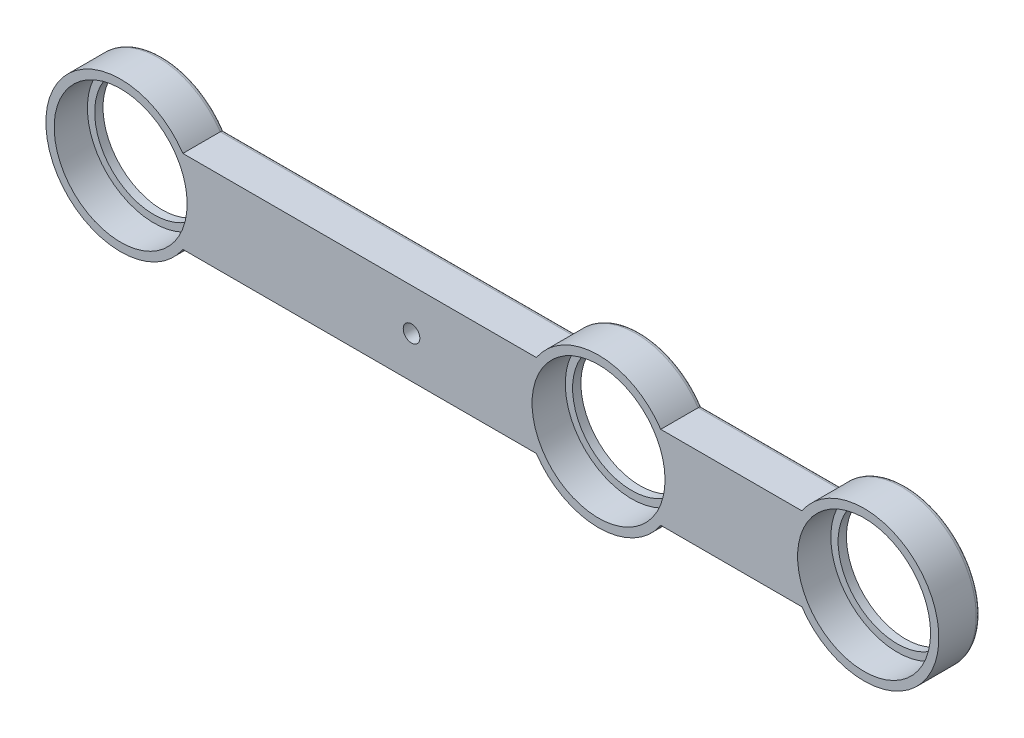
ISO-10303-21;
HEADER;
FILE_DESCRIPTION(('STEP AP214'),'2;1');
FILE_NAME('part.step','',(''),(''),'','','');
FILE_SCHEMA(('AUTOMOTIVE_DESIGN { 1 0 10303 214 1 1 1 1 }'));
ENDSEC;
DATA;
#1=APPLICATION_CONTEXT('core data for automotive mechanical design processes');
#2=APPLICATION_PROTOCOL_DEFINITION('international standard','automotive_design',2000,#1);
#3=PRODUCT_CONTEXT('',#1,'mechanical');
#4=PRODUCT('Part','Part','',(#3));
#5=PRODUCT_RELATED_PRODUCT_CATEGORY('part','',(#4));
#6=PRODUCT_DEFINITION_FORMATION('','',#4);
#7=PRODUCT_DEFINITION_CONTEXT('part definition',#1,'design');
#8=PRODUCT_DEFINITION('design','',#6,#7);
#9=PRODUCT_DEFINITION_SHAPE('','',#8);
#10=(LENGTH_UNIT() NAMED_UNIT(*) SI_UNIT(.MILLI.,.METRE.));
#11=(NAMED_UNIT(*) PLANE_ANGLE_UNIT() SI_UNIT($,.RADIAN.));
#12=(NAMED_UNIT(*) SI_UNIT($,.STERADIAN.) SOLID_ANGLE_UNIT());
#13=UNCERTAINTY_MEASURE_WITH_UNIT(LENGTH_MEASURE(1.E-05),#10,'distance_accuracy_value','');
#14=(GEOMETRIC_REPRESENTATION_CONTEXT(3) GLOBAL_UNCERTAINTY_ASSIGNED_CONTEXT((#13)) GLOBAL_UNIT_ASSIGNED_CONTEXT((#10,
#11,#12)) REPRESENTATION_CONTEXT('',''));
#15=CARTESIAN_POINT('',(0.,0.,0.));
#16=DIRECTION('',(0.,0.,1.));
#17=DIRECTION('',(1.,0.,0.));
#18=AXIS2_PLACEMENT_3D('',#15,#16,#17);
#19=CARTESIAN_POINT('',(-115.,0.,4.));
#20=DIRECTION('',(0.,0.,-1.));
#21=DIRECTION('',(-1.,0.,0.));
#22=AXIS2_PLACEMENT_3D('',#19,#20,#21);
#23=CYLINDRICAL_SURFACE('',#22,18.);
#24=DIRECTION('',(0.,0.,-1.));
#25=VECTOR('',#24,1.);
#26=CARTESIAN_POINT('',(-100.033370452904,10.,4.));
#27=LINE('',#26,#25);
#28=CARTESIAN_POINT('',(-100.033370452904,10.,10.));
#29=VERTEX_POINT('',#28);
#30=CARTESIAN_POINT('',(-100.033370452904,10.,1.));
#31=VERTEX_POINT('',#30);
#32=EDGE_CURVE('E219',#29,#31,#27,.T.);
#33=ORIENTED_EDGE('',*,*,#32,.T.);
#34=CARTESIAN_POINT('',(-115.,0.,1.));
#35=DIRECTION('',(0.,0.,1.));
#36=DIRECTION('',(1.,0.,0.));
#37=AXIS2_PLACEMENT_3D('',#34,#35,#36);
#38=CIRCLE('',#37,18.);
#39=CARTESIAN_POINT('',(-100.033370452904,-10.,1.));
#40=VERTEX_POINT('',#39);
#41=EDGE_CURVE('E11',#31,#40,#38,.T.);
#42=ORIENTED_EDGE('',*,*,#41,.T.);
#43=DIRECTION('',(0.,0.,-1.));
#44=VECTOR('',#43,1.);
#45=CARTESIAN_POINT('',(-100.033370452904,-10.,4.));
#46=LINE('',#45,#44);
#47=CARTESIAN_POINT('',(-100.033370452904,-10.,10.));
#48=VERTEX_POINT('',#47);
#49=EDGE_CURVE('E134',#48,#40,#46,.T.);
#50=ORIENTED_EDGE('',*,*,#49,.F.);
#51=CARTESIAN_POINT('',(-115.,0.,10.));
#52=DIRECTION('',(0.,0.,1.));
#53=DIRECTION('',(1.,0.,0.));
#54=AXIS2_PLACEMENT_3D('',#51,#52,#53);
#55=CIRCLE('',#54,18.);
#56=EDGE_CURVE('E137',#29,#48,#55,.T.);
#57=ORIENTED_EDGE('',*,*,#56,.F.);
#58=EDGE_LOOP('',(#33,#42,#50,#57));
#59=FACE_BOUND('',#58,.T.);
#60=ADVANCED_FACE('F38',(#59),#23,.T.);
#61=CARTESIAN_POINT('',(-100.033370452904,-10.,4.));
#62=DIRECTION('',(0.,1.,0.));
#63=DIRECTION('',(0.,0.,1.));
#64=AXIS2_PLACEMENT_3D('',#61,#62,#63);
#65=PLANE('',#64);
#66=ORIENTED_EDGE('',*,*,#49,.T.);
#67=DIRECTION('',(1.,0.,0.));
#68=VECTOR('',#67,1.);
#69=CARTESIAN_POINT('',(-100.033370452904,-10.,1.));
#70=LINE('',#69,#68);
#71=CARTESIAN_POINT('',(-14.9666295470958,-9.99999999999999,1.));
#72=VERTEX_POINT('',#71);
#73=EDGE_CURVE('E143',#40,#72,#70,.T.);
#74=ORIENTED_EDGE('',*,*,#73,.T.);
#75=DIRECTION('',(0.,0.,-1.));
#76=VECTOR('',#75,1.);
#77=CARTESIAN_POINT('',(-14.9666295470958,-9.99999999999999,4.));
#78=LINE('',#77,#76);
#79=CARTESIAN_POINT('',(-14.9666295470958,-9.99999999999999,10.));
#80=VERTEX_POINT('',#79);
#81=EDGE_CURVE('E144',#80,#72,#78,.T.);
#82=ORIENTED_EDGE('',*,*,#81,.F.);
#83=DIRECTION('',(1.,0.,0.));
#84=VECTOR('',#83,1.);
#85=CARTESIAN_POINT('',(-100.033370452904,-10.,10.));
#86=LINE('',#85,#84);
#87=EDGE_CURVE('E147',#48,#80,#86,.T.);
#88=ORIENTED_EDGE('',*,*,#87,.F.);
#89=EDGE_LOOP('',(#66,#74,#82,#88));
#90=FACE_BOUND('',#89,.T.);
#91=ADVANCED_FACE('F148',(#90),#65,.F.);
#92=CARTESIAN_POINT('',(0.,0.,4.));
#93=DIRECTION('',(0.,0.,-1.));
#94=DIRECTION('',(-1.,0.,0.));
#95=AXIS2_PLACEMENT_3D('',#92,#93,#94);
#96=CYLINDRICAL_SURFACE('',#95,18.);
#97=ORIENTED_EDGE('',*,*,#81,.T.);
#98=CARTESIAN_POINT('',(0.,0.,1.));
#99=DIRECTION('',(0.,0.,1.));
#100=DIRECTION('',(1.,0.,0.));
#101=AXIS2_PLACEMENT_3D('',#98,#99,#100);
#102=CIRCLE('',#101,18.);
#103=CARTESIAN_POINT('',(14.9666295470958,-10.,1.));
#104=VERTEX_POINT('',#103);
#105=EDGE_CURVE('E276',#72,#104,#102,.T.);
#106=ORIENTED_EDGE('',*,*,#105,.T.);
#107=DIRECTION('',(0.,0.,-1.));
#108=VECTOR('',#107,1.);
#109=CARTESIAN_POINT('',(14.9666295470958,-10.,4.));
#110=LINE('',#109,#108);
#111=CARTESIAN_POINT('',(14.9666295470958,-10.,10.));
#112=VERTEX_POINT('',#111);
#113=EDGE_CURVE('E243',#112,#104,#110,.T.);
#114=ORIENTED_EDGE('',*,*,#113,.F.);
#115=CARTESIAN_POINT('',(0.,0.,10.));
#116=DIRECTION('',(0.,0.,1.));
#117=DIRECTION('',(1.,0.,0.));
#118=AXIS2_PLACEMENT_3D('',#115,#116,#117);
#119=CIRCLE('',#118,18.);
#120=EDGE_CURVE('E154',#80,#112,#119,.T.);
#121=ORIENTED_EDGE('',*,*,#120,.F.);
#122=EDGE_LOOP('',(#97,#106,#114,#121));
#123=FACE_BOUND('',#122,.T.);
#124=ADVANCED_FACE('F442',(#123),#96,.T.);
#125=CARTESIAN_POINT('',(14.9666295470958,-10.,4.));
#126=DIRECTION('',(0.,1.,0.));
#127=DIRECTION('',(0.,0.,1.));
#128=AXIS2_PLACEMENT_3D('',#125,#126,#127);
#129=PLANE('',#128);
#130=ORIENTED_EDGE('',*,*,#113,.T.);
#131=DIRECTION('',(1.,0.,0.));
#132=VECTOR('',#131,1.);
#133=CARTESIAN_POINT('',(14.9666295470958,-10.,1.));
#134=LINE('',#133,#132);
#135=CARTESIAN_POINT('',(48.9333704529042,-10.,1.));
#136=VERTEX_POINT('',#135);
#137=EDGE_CURVE('E279',#104,#136,#134,.T.);
#138=ORIENTED_EDGE('',*,*,#137,.T.);
#139=DIRECTION('',(0.,0.,-1.));
#140=VECTOR('',#139,1.);
#141=CARTESIAN_POINT('',(48.9333704529042,-10.,4.));
#142=LINE('',#141,#140);
#143=CARTESIAN_POINT('',(48.9333704529042,-10.,10.));
#144=VERTEX_POINT('',#143);
#145=EDGE_CURVE('E239',#144,#136,#142,.T.);
#146=ORIENTED_EDGE('',*,*,#145,.F.);
#147=DIRECTION('',(1.,0.,0.));
#148=VECTOR('',#147,1.);
#149=CARTESIAN_POINT('',(14.9666295470958,-10.,10.));
#150=LINE('',#149,#148);
#151=EDGE_CURVE('E173',#112,#144,#150,.T.);
#152=ORIENTED_EDGE('',*,*,#151,.F.);
#153=EDGE_LOOP('',(#130,#138,#146,#152));
#154=FACE_BOUND('',#153,.T.);
#155=ADVANCED_FACE('F447',(#154),#129,.F.);
#156=CARTESIAN_POINT('',(63.9,0.,4.));
#157=DIRECTION('',(0.,0.,-1.));
#158=DIRECTION('',(-1.,0.,0.));
#159=AXIS2_PLACEMENT_3D('',#156,#157,#158);
#160=CYLINDRICAL_SURFACE('',#159,18.);
#161=ORIENTED_EDGE('',*,*,#145,.T.);
#162=CARTESIAN_POINT('',(63.9,0.,1.));
#163=DIRECTION('',(0.,0.,1.));
#164=DIRECTION('',(1.,0.,0.));
#165=AXIS2_PLACEMENT_3D('',#162,#163,#164);
#166=CIRCLE('',#165,18.);
#167=CARTESIAN_POINT('',(48.9333704529042,10.,1.));
#168=VERTEX_POINT('',#167);
#169=EDGE_CURVE('E282',#136,#168,#166,.T.);
#170=ORIENTED_EDGE('',*,*,#169,.T.);
#171=DIRECTION('',(0.,0.,-1.));
#172=VECTOR('',#171,1.);
#173=CARTESIAN_POINT('',(48.9333704529042,10.,4.));
#174=LINE('',#173,#172);
#175=CARTESIAN_POINT('',(48.9333704529042,10.,10.));
#176=VERTEX_POINT('',#175);
#177=EDGE_CURVE('E235',#176,#168,#174,.T.);
#178=ORIENTED_EDGE('',*,*,#177,.F.);
#179=CARTESIAN_POINT('',(63.9,0.,10.));
#180=DIRECTION('',(0.,0.,1.));
#181=DIRECTION('',(1.,0.,0.));
#182=AXIS2_PLACEMENT_3D('',#179,#180,#181);
#183=CIRCLE('',#182,18.);
#184=EDGE_CURVE('E177',#144,#176,#183,.T.);
#185=ORIENTED_EDGE('',*,*,#184,.F.);
#186=EDGE_LOOP('',(#161,#170,#178,#185));
#187=FACE_BOUND('',#186,.T.);
#188=ADVANCED_FACE('F451',(#187),#160,.T.);
#189=CARTESIAN_POINT('',(14.9666295470958,10.,4.));
#190=DIRECTION('',(0.,-1.,0.));
#191=DIRECTION('',(0.,0.,-1.));
#192=AXIS2_PLACEMENT_3D('',#189,#190,#191);
#193=PLANE('',#192);
#194=ORIENTED_EDGE('',*,*,#177,.T.);
#195=DIRECTION('',(-1.,0.,0.));
#196=VECTOR('',#195,1.);
#197=CARTESIAN_POINT('',(14.9666295470958,10.,1.));
#198=LINE('',#197,#196);
#199=CARTESIAN_POINT('',(14.9666295470958,10.,1.));
#200=VERTEX_POINT('',#199);
#201=EDGE_CURVE('E285',#168,#200,#198,.T.);
#202=ORIENTED_EDGE('',*,*,#201,.T.);
#203=DIRECTION('',(0.,0.,-1.));
#204=VECTOR('',#203,1.);
#205=CARTESIAN_POINT('',(14.9666295470958,10.,4.));
#206=LINE('',#205,#204);
#207=CARTESIAN_POINT('',(14.9666295470958,10.,10.));
#208=VERTEX_POINT('',#207);
#209=EDGE_CURVE('E232',#208,#200,#206,.T.);
#210=ORIENTED_EDGE('',*,*,#209,.F.);
#211=DIRECTION('',(-1.,0.,0.));
#212=VECTOR('',#211,1.);
#213=CARTESIAN_POINT('',(48.9333704529042,10.,10.));
#214=LINE('',#213,#212);
#215=EDGE_CURVE('E181',#176,#208,#214,.T.);
#216=ORIENTED_EDGE('',*,*,#215,.F.);
#217=EDGE_LOOP('',(#194,#202,#210,#216));
#218=FACE_BOUND('',#217,.T.);
#219=ADVANCED_FACE('F455',(#218),#193,.F.);
#220=CARTESIAN_POINT('',(0.,0.,4.));
#221=DIRECTION('',(0.,0.,-1.));
#222=DIRECTION('',(-1.,0.,0.));
#223=AXIS2_PLACEMENT_3D('',#220,#221,#222);
#224=CYLINDRICAL_SURFACE('',#223,18.);
#225=ORIENTED_EDGE('',*,*,#209,.T.);
#226=CARTESIAN_POINT('',(0.,0.,1.));
#227=DIRECTION('',(0.,0.,1.));
#228=DIRECTION('',(1.,0.,0.));
#229=AXIS2_PLACEMENT_3D('',#226,#227,#228);
#230=CIRCLE('',#229,18.);
#231=CARTESIAN_POINT('',(-14.9666295470958,10.,1.));
#232=VERTEX_POINT('',#231);
#233=EDGE_CURVE('E68',#200,#232,#230,.T.);
#234=ORIENTED_EDGE('',*,*,#233,.T.);
#235=DIRECTION('',(0.,0.,-1.));
#236=VECTOR('',#235,1.);
#237=CARTESIAN_POINT('',(-14.9666295470958,10.,4.));
#238=LINE('',#237,#236);
#239=CARTESIAN_POINT('',(-14.9666295470958,10.,10.));
#240=VERTEX_POINT('',#239);
#241=EDGE_CURVE('E229',#240,#232,#238,.T.);
#242=ORIENTED_EDGE('',*,*,#241,.F.);
#243=CARTESIAN_POINT('',(0.,0.,10.));
#244=DIRECTION('',(0.,0.,1.));
#245=DIRECTION('',(1.,0.,0.));
#246=AXIS2_PLACEMENT_3D('',#243,#244,#245);
#247=CIRCLE('',#246,18.);
#248=EDGE_CURVE('E185',#208,#240,#247,.T.);
#249=ORIENTED_EDGE('',*,*,#248,.F.);
#250=EDGE_LOOP('',(#225,#234,#242,#249));
#251=FACE_BOUND('',#250,.T.);
#252=ADVANCED_FACE('F459',(#251),#224,.T.);
#253=CARTESIAN_POINT('',(-100.033370452904,10.,4.));
#254=DIRECTION('',(0.,-1.,0.));
#255=DIRECTION('',(0.,0.,-1.));
#256=AXIS2_PLACEMENT_3D('',#253,#254,#255);
#257=PLANE('',#256);
#258=ORIENTED_EDGE('',*,*,#241,.T.);
#259=DIRECTION('',(-1.,0.,0.));
#260=VECTOR('',#259,1.);
#261=CARTESIAN_POINT('',(-100.033370452904,10.,1.));
#262=LINE('',#261,#260);
#263=EDGE_CURVE('E53',#232,#31,#262,.T.);
#264=ORIENTED_EDGE('',*,*,#263,.T.);
#265=ORIENTED_EDGE('',*,*,#32,.F.);
#266=DIRECTION('',(-1.,0.,0.));
#267=VECTOR('',#266,1.);
#268=CARTESIAN_POINT('',(-14.9666295470958,10.,10.));
#269=LINE('',#268,#267);
#270=EDGE_CURVE('E161',#240,#29,#269,.T.);
#271=ORIENTED_EDGE('',*,*,#270,.F.);
#272=EDGE_LOOP('',(#258,#264,#265,#271));
#273=FACE_BOUND('',#272,.T.);
#274=ADVANCED_FACE('F463',(#273),#257,.F.);
#275=CARTESIAN_POINT('',(-115.,0.,0.));
#276=DIRECTION('',(0.,0.,1.));
#277=DIRECTION('',(1.,0.,0.));
#278=AXIS2_PLACEMENT_3D('',#275,#276,#277);
#279=PLANE('',#278);
#280=CARTESIAN_POINT('',(-45.,0.,0.));
#281=DIRECTION('',(0.,0.,-1.));
#282=DIRECTION('',(-1.,0.,0.));
#283=AXIS2_PLACEMENT_3D('',#280,#281,#282);
#284=CIRCLE('',#283,2.);
#285=CARTESIAN_POINT('',(-47.,0.,0.));
#286=VERTEX_POINT('',#285);
#287=EDGE_CURVE('E409',#286,#286,#284,.T.);
#288=ORIENTED_EDGE('',*,*,#287,.F.);
#289=EDGE_LOOP('',(#288));
#290=FACE_BOUND('',#289,.T.);
#291=CARTESIAN_POINT('',(0.,0.,0.));
#292=DIRECTION('',(0.,0.,1.));
#293=DIRECTION('',(1.,0.,0.));
#294=AXIS2_PLACEMENT_3D('',#291,#292,#293);
#295=CIRCLE('',#294,17.);
#296=CARTESIAN_POINT('',(14.422205101856,-9.,0.));
#297=VERTEX_POINT('',#296);
#298=CARTESIAN_POINT('',(-14.422205101856,-9.,0.));
#299=VERTEX_POINT('',#298);
#300=EDGE_CURVE('E269',#297,#299,#295,.F.);
#301=ORIENTED_EDGE('',*,*,#300,.T.);
#302=DIRECTION('',(1.,0.,0.));
#303=VECTOR('',#302,1.);
#304=CARTESIAN_POINT('',(-115.,-9.,0.));
#305=LINE('',#304,#303);
#306=CARTESIAN_POINT('',(-100.577794898144,-9.,0.));
#307=VERTEX_POINT('',#306);
#308=EDGE_CURVE('E272',#299,#307,#305,.F.);
#309=ORIENTED_EDGE('',*,*,#308,.T.);
#310=CARTESIAN_POINT('',(-115.,0.,0.));
#311=DIRECTION('',(0.,0.,1.));
#312=DIRECTION('',(1.,0.,0.));
#313=AXIS2_PLACEMENT_3D('',#310,#311,#312);
#314=CIRCLE('',#313,17.);
#315=CARTESIAN_POINT('',(-100.577794898144,9.,0.));
#316=VERTEX_POINT('',#315);
#317=EDGE_CURVE('E251',#307,#316,#314,.F.);
#318=ORIENTED_EDGE('',*,*,#317,.T.);
#319=DIRECTION('',(-1.,0.,0.));
#320=VECTOR('',#319,1.);
#321=CARTESIAN_POINT('',(-115.,9.,0.));
#322=LINE('',#321,#320);
#323=CARTESIAN_POINT('',(-14.422205101856,9.,0.));
#324=VERTEX_POINT('',#323);
#325=EDGE_CURVE('E254',#316,#324,#322,.F.);
#326=ORIENTED_EDGE('',*,*,#325,.T.);
#327=CARTESIAN_POINT('',(0.,0.,0.));
#328=DIRECTION('',(0.,0.,1.));
#329=DIRECTION('',(1.,0.,0.));
#330=AXIS2_PLACEMENT_3D('',#327,#328,#329);
#331=CIRCLE('',#330,17.);
#332=CARTESIAN_POINT('',(14.422205101856,9.,0.));
#333=VERTEX_POINT('',#332);
#334=EDGE_CURVE('E257',#324,#333,#331,.F.);
#335=ORIENTED_EDGE('',*,*,#334,.T.);
#336=DIRECTION('',(-1.,0.,0.));
#337=VECTOR('',#336,1.);
#338=CARTESIAN_POINT('',(-115.,9.,0.));
#339=LINE('',#338,#337);
#340=CARTESIAN_POINT('',(49.477794898144,9.,0.));
#341=VERTEX_POINT('',#340);
#342=EDGE_CURVE('E260',#333,#341,#339,.F.);
#343=ORIENTED_EDGE('',*,*,#342,.T.);
#344=CARTESIAN_POINT('',(63.9,0.,0.));
#345=DIRECTION('',(0.,0.,1.));
#346=DIRECTION('',(1.,0.,0.));
#347=AXIS2_PLACEMENT_3D('',#344,#345,#346);
#348=CIRCLE('',#347,17.);
#349=CARTESIAN_POINT('',(49.477794898144,-9.,0.));
#350=VERTEX_POINT('',#349);
#351=EDGE_CURVE('E263',#341,#350,#348,.F.);
#352=ORIENTED_EDGE('',*,*,#351,.T.);
#353=DIRECTION('',(1.,0.,0.));
#354=VECTOR('',#353,1.);
#355=CARTESIAN_POINT('',(-115.,-9.,0.));
#356=LINE('',#355,#354);
#357=EDGE_CURVE('E266',#350,#297,#356,.F.);
#358=ORIENTED_EDGE('',*,*,#357,.T.);
#359=EDGE_LOOP('',(#301,#309,#318,#326,#335,#343,#352,#358));
#360=FACE_BOUND('',#359,.T.);
#361=CARTESIAN_POINT('',(-115.,0.,0.));
#362=DIRECTION('',(0.,0.,1.));
#363=DIRECTION('',(1.,0.,0.));
#364=AXIS2_PLACEMENT_3D('',#361,#362,#363);
#365=CIRCLE('',#364,14.25);
#366=CARTESIAN_POINT('',(-100.75,0.,0.));
#367=VERTEX_POINT('',#366);
#368=EDGE_CURVE('E191',#367,#367,#365,.T.);
#369=ORIENTED_EDGE('',*,*,#368,.T.);
#370=EDGE_LOOP('',(#369));
#371=FACE_BOUND('',#370,.T.);
#372=CARTESIAN_POINT('',(0.,0.,0.));
#373=DIRECTION('',(0.,0.,1.));
#374=DIRECTION('',(1.,0.,0.));
#375=AXIS2_PLACEMENT_3D('',#372,#373,#374);
#376=CIRCLE('',#375,14.25);
#377=CARTESIAN_POINT('',(14.25,0.,0.));
#378=VERTEX_POINT('',#377);
#379=EDGE_CURVE('E200',#378,#378,#376,.T.);
#380=ORIENTED_EDGE('',*,*,#379,.T.);
#381=EDGE_LOOP('',(#380));
#382=FACE_BOUND('',#381,.T.);
#383=CARTESIAN_POINT('',(63.9,0.,0.));
#384=DIRECTION('',(0.,0.,1.));
#385=DIRECTION('',(1.,0.,0.));
#386=AXIS2_PLACEMENT_3D('',#383,#384,#385);
#387=CIRCLE('',#386,14.25);
#388=CARTESIAN_POINT('',(78.15,0.,0.));
#389=VERTEX_POINT('',#388);
#390=EDGE_CURVE('E208',#389,#389,#387,.T.);
#391=ORIENTED_EDGE('',*,*,#390,.T.);
#392=EDGE_LOOP('',(#391));
#393=FACE_BOUND('',#392,.T.);
#394=ADVANCED_FACE('F388',(#290,#360,#371,#382,#393),#279,.F.);
#395=CARTESIAN_POINT('',(63.9,0.,2.));
#396=DIRECTION('',(0.,0.,1.));
#397=DIRECTION('',(1.,0.,0.));
#398=AXIS2_PLACEMENT_3D('',#395,#396,#397);
#399=CYLINDRICAL_SURFACE('',#398,16.);
#400=CARTESIAN_POINT('',(63.9,0.,2.));
#401=DIRECTION('',(0.,0.,1.));
#402=DIRECTION('',(1.,0.,0.));
#403=AXIS2_PLACEMENT_3D('',#400,#401,#402);
#404=CIRCLE('',#403,16.);
#405=CARTESIAN_POINT('',(79.9,0.,2.));
#406=VERTEX_POINT('',#405);
#407=EDGE_CURVE('E195',#406,#406,#404,.T.);
#408=ORIENTED_EDGE('',*,*,#407,.F.);
#409=EDGE_LOOP('',(#408));
#410=FACE_BOUND('',#409,.T.);
#411=CARTESIAN_POINT('',(63.9,0.,10.));
#412=DIRECTION('',(0.,0.,1.));
#413=DIRECTION('',(1.,0.,0.));
#414=AXIS2_PLACEMENT_3D('',#411,#412,#413);
#415=CIRCLE('',#414,16.);
#416=CARTESIAN_POINT('',(79.9,0.,10.));
#417=VERTEX_POINT('',#416);
#418=EDGE_CURVE('E163',#417,#417,#415,.T.);
#419=ORIENTED_EDGE('',*,*,#418,.T.);
#420=EDGE_LOOP('',(#419));
#421=FACE_BOUND('',#420,.T.);
#422=ADVANCED_FACE('F467',(#410,#421),#399,.F.);
#423=CARTESIAN_POINT('',(63.9,0.,2.));
#424=DIRECTION('',(0.,0.,1.));
#425=DIRECTION('',(1.,0.,0.));
#426=AXIS2_PLACEMENT_3D('',#423,#424,#425);
#427=PLANE('',#426);
#428=CARTESIAN_POINT('',(63.9,0.,2.));
#429=DIRECTION('',(0.,0.,1.));
#430=DIRECTION('',(1.,0.,0.));
#431=AXIS2_PLACEMENT_3D('',#428,#429,#430);
#432=CIRCLE('',#431,14.25);
#433=CARTESIAN_POINT('',(78.15,0.,2.));
#434=VERTEX_POINT('',#433);
#435=EDGE_CURVE('E190',#434,#434,#432,.T.);
#436=ORIENTED_EDGE('',*,*,#435,.F.);
#437=EDGE_LOOP('',(#436));
#438=FACE_BOUND('',#437,.T.);
#439=ORIENTED_EDGE('',*,*,#407,.T.);
#440=EDGE_LOOP('',(#439));
#441=FACE_BOUND('',#440,.T.);
#442=ADVANCED_FACE('F471',(#438,#441),#427,.T.);
#443=CARTESIAN_POINT('',(0.,0.,2.));
#444=DIRECTION('',(0.,0.,1.));
#445=DIRECTION('',(1.,0.,0.));
#446=AXIS2_PLACEMENT_3D('',#443,#444,#445);
#447=CYLINDRICAL_SURFACE('',#446,16.);
#448=CARTESIAN_POINT('',(0.,0.,2.));
#449=DIRECTION('',(0.,0.,1.));
#450=DIRECTION('',(1.,0.,0.));
#451=AXIS2_PLACEMENT_3D('',#448,#449,#450);
#452=CIRCLE('',#451,16.);
#453=CARTESIAN_POINT('',(16.,0.,2.));
#454=VERTEX_POINT('',#453);
#455=EDGE_CURVE('E220',#454,#454,#452,.T.);
#456=ORIENTED_EDGE('',*,*,#455,.F.);
#457=EDGE_LOOP('',(#456));
#458=FACE_BOUND('',#457,.T.);
#459=CARTESIAN_POINT('',(0.,0.,10.));
#460=DIRECTION('',(0.,0.,1.));
#461=DIRECTION('',(1.,0.,0.));
#462=AXIS2_PLACEMENT_3D('',#459,#460,#461);
#463=CIRCLE('',#462,16.);
#464=CARTESIAN_POINT('',(16.,0.,10.));
#465=VERTEX_POINT('',#464);
#466=EDGE_CURVE('E167',#465,#465,#463,.T.);
#467=ORIENTED_EDGE('',*,*,#466,.T.);
#468=EDGE_LOOP('',(#467));
#469=FACE_BOUND('',#468,.T.);
#470=ADVANCED_FACE('F422',(#458,#469),#447,.F.);
#471=CARTESIAN_POINT('',(0.,0.,2.));
#472=DIRECTION('',(0.,0.,1.));
#473=DIRECTION('',(1.,0.,0.));
#474=AXIS2_PLACEMENT_3D('',#471,#472,#473);
#475=PLANE('',#474);
#476=CARTESIAN_POINT('',(0.,0.,2.));
#477=DIRECTION('',(0.,0.,1.));
#478=DIRECTION('',(1.,0.,0.));
#479=AXIS2_PLACEMENT_3D('',#476,#477,#478);
#480=CIRCLE('',#479,14.25);
#481=CARTESIAN_POINT('',(14.25,0.,2.));
#482=VERTEX_POINT('',#481);
#483=EDGE_CURVE('E204',#482,#482,#480,.T.);
#484=ORIENTED_EDGE('',*,*,#483,.F.);
#485=EDGE_LOOP('',(#484));
#486=FACE_BOUND('',#485,.T.);
#487=ORIENTED_EDGE('',*,*,#455,.T.);
#488=EDGE_LOOP('',(#487));
#489=FACE_BOUND('',#488,.T.);
#490=ADVANCED_FACE('F478',(#486,#489),#475,.T.);
#491=CARTESIAN_POINT('',(-115.,0.,2.));
#492=DIRECTION('',(0.,0.,1.));
#493=DIRECTION('',(1.,0.,0.));
#494=AXIS2_PLACEMENT_3D('',#491,#492,#493);
#495=CYLINDRICAL_SURFACE('',#494,16.);
#496=CARTESIAN_POINT('',(-115.,0.,2.));
#497=DIRECTION('',(0.,0.,1.));
#498=DIRECTION('',(1.,0.,0.));
#499=AXIS2_PLACEMENT_3D('',#496,#497,#498);
#500=CIRCLE('',#499,16.);
#501=CARTESIAN_POINT('',(-99.,0.,2.));
#502=VERTEX_POINT('',#501);
#503=EDGE_CURVE('E215',#502,#502,#500,.T.);
#504=ORIENTED_EDGE('',*,*,#503,.F.);
#505=EDGE_LOOP('',(#504));
#506=FACE_BOUND('',#505,.T.);
#507=CARTESIAN_POINT('',(-115.,0.,10.));
#508=DIRECTION('',(0.,0.,1.));
#509=DIRECTION('',(1.,0.,0.));
#510=AXIS2_PLACEMENT_3D('',#507,#508,#509);
#511=CIRCLE('',#510,16.);
#512=CARTESIAN_POINT('',(-99.,0.,10.));
#513=VERTEX_POINT('',#512);
#514=EDGE_CURVE('E376',#513,#513,#511,.T.);
#515=ORIENTED_EDGE('',*,*,#514,.T.);
#516=EDGE_LOOP('',(#515));
#517=FACE_BOUND('',#516,.T.);
#518=ADVANCED_FACE('F482',(#506,#517),#495,.F.);
#519=CARTESIAN_POINT('',(-115.,0.,2.));
#520=DIRECTION('',(0.,0.,1.));
#521=DIRECTION('',(1.,0.,0.));
#522=AXIS2_PLACEMENT_3D('',#519,#520,#521);
#523=PLANE('',#522);
#524=CARTESIAN_POINT('',(-115.,0.,2.));
#525=DIRECTION('',(0.,0.,1.));
#526=DIRECTION('',(1.,0.,0.));
#527=AXIS2_PLACEMENT_3D('',#524,#525,#526);
#528=CIRCLE('',#527,14.25);
#529=CARTESIAN_POINT('',(-100.75,0.,2.));
#530=VERTEX_POINT('',#529);
#531=EDGE_CURVE('E196',#530,#530,#528,.T.);
#532=ORIENTED_EDGE('',*,*,#531,.F.);
#533=EDGE_LOOP('',(#532));
#534=FACE_BOUND('',#533,.T.);
#535=ORIENTED_EDGE('',*,*,#503,.T.);
#536=EDGE_LOOP('',(#535));
#537=FACE_BOUND('',#536,.T.);
#538=ADVANCED_FACE('F486',(#534,#537),#523,.T.);
#539=CARTESIAN_POINT('',(63.9,0.,0.));
#540=DIRECTION('',(0.,0.,1.));
#541=DIRECTION('',(1.,0.,0.));
#542=AXIS2_PLACEMENT_3D('',#539,#540,#541);
#543=CYLINDRICAL_SURFACE('',#542,14.25);
#544=ORIENTED_EDGE('',*,*,#390,.F.);
#545=EDGE_LOOP('',(#544));
#546=FACE_BOUND('',#545,.T.);
#547=ORIENTED_EDGE('',*,*,#435,.T.);
#548=EDGE_LOOP('',(#547));
#549=FACE_BOUND('',#548,.T.);
#550=ADVANCED_FACE('F490',(#546,#549),#543,.F.);
#551=CARTESIAN_POINT('',(0.,0.,0.));
#552=DIRECTION('',(0.,0.,1.));
#553=DIRECTION('',(1.,0.,0.));
#554=AXIS2_PLACEMENT_3D('',#551,#552,#553);
#555=CYLINDRICAL_SURFACE('',#554,14.25);
#556=ORIENTED_EDGE('',*,*,#379,.F.);
#557=EDGE_LOOP('',(#556));
#558=FACE_BOUND('',#557,.T.);
#559=ORIENTED_EDGE('',*,*,#483,.T.);
#560=EDGE_LOOP('',(#559));
#561=FACE_BOUND('',#560,.T.);
#562=ADVANCED_FACE('F434',(#558,#561),#555,.F.);
#563=CARTESIAN_POINT('',(-115.,0.,0.));
#564=DIRECTION('',(0.,0.,1.));
#565=DIRECTION('',(1.,0.,0.));
#566=AXIS2_PLACEMENT_3D('',#563,#564,#565);
#567=CYLINDRICAL_SURFACE('',#566,14.25);
#568=ORIENTED_EDGE('',*,*,#368,.F.);
#569=EDGE_LOOP('',(#568));
#570=FACE_BOUND('',#569,.T.);
#571=ORIENTED_EDGE('',*,*,#531,.T.);
#572=EDGE_LOOP('',(#571));
#573=FACE_BOUND('',#572,.T.);
#574=ADVANCED_FACE('F425',(#570,#573),#567,.F.);
#575=CARTESIAN_POINT('',(-115.,0.,10.));
#576=DIRECTION('',(0.,0.,1.));
#577=DIRECTION('',(1.,0.,0.));
#578=AXIS2_PLACEMENT_3D('',#575,#576,#577);
#579=PLANE('',#578);
#580=CARTESIAN_POINT('',(-45.,0.,10.));
#581=DIRECTION('',(0.,0.,-1.));
#582=DIRECTION('',(-1.,0.,0.));
#583=AXIS2_PLACEMENT_3D('',#580,#581,#582);
#584=CIRCLE('',#583,2.);
#585=CARTESIAN_POINT('',(-47.,0.,10.));
#586=VERTEX_POINT('',#585);
#587=EDGE_CURVE('E302',#586,#586,#584,.T.);
#588=ORIENTED_EDGE('',*,*,#587,.T.);
#589=EDGE_LOOP('',(#588));
#590=FACE_BOUND('',#589,.T.);
#591=ORIENTED_EDGE('',*,*,#466,.F.);
#592=EDGE_LOOP('',(#591));
#593=FACE_BOUND('',#592,.T.);
#594=ORIENTED_EDGE('',*,*,#56,.T.);
#595=ORIENTED_EDGE('',*,*,#87,.T.);
#596=ORIENTED_EDGE('',*,*,#120,.T.);
#597=ORIENTED_EDGE('',*,*,#151,.T.);
#598=ORIENTED_EDGE('',*,*,#184,.T.);
#599=ORIENTED_EDGE('',*,*,#215,.T.);
#600=ORIENTED_EDGE('',*,*,#248,.T.);
#601=ORIENTED_EDGE('',*,*,#270,.T.);
#602=EDGE_LOOP('',(#594,#595,#596,#597,#598,#599,#600,#601));
#603=FACE_BOUND('',#602,.T.);
#604=ORIENTED_EDGE('',*,*,#418,.F.);
#605=EDGE_LOOP('',(#604));
#606=FACE_BOUND('',#605,.T.);
#607=ORIENTED_EDGE('',*,*,#514,.F.);
#608=EDGE_LOOP('',(#607));
#609=FACE_BOUND('',#608,.T.);
#610=ADVANCED_FACE('F157',(#590,#593,#603,#606,#609),#579,.T.);
#611=CARTESIAN_POINT('',(14.9666295470958,9.,1.));
#612=DIRECTION('',(-1.,0.,0.));
#613=DIRECTION('',(0.,0.,1.));
#614=AXIS2_PLACEMENT_3D('',#611,#612,#613);
#615=CYLINDRICAL_SURFACE('',#614,1.);
#616=CARTESIAN_POINT('',(48.9333704529042,10.,1.));
#617=CARTESIAN_POINT('',(48.9333698252511,10.0000013474836,0.974264752844076));
#618=CARTESIAN_POINT('',(48.9339018647881,9.99900580189564,0.948542783264874));
#619=CARTESIAN_POINT('',(48.9360195159283,9.99504439047454,0.897302001713908));
#620=CARTESIAN_POINT('',(48.9376048236923,9.99207909286146,0.871783133300754));
#621=CARTESIAN_POINT('',(48.9439038940426,9.98029950846768,0.79600923252836));
#622=CARTESIAN_POINT('',(48.9501610586637,9.96860102767556,0.746294517708575));
#623=CARTESIAN_POINT('',(48.9665111924243,9.93806388943264,0.6498603962284));
#624=CARTESIAN_POINT('',(48.9766016087315,9.91922998398631,0.603139020240688));
#625=CARTESIAN_POINT('',(49.0002151722055,9.87521555648192,0.513704592547626));
#626=CARTESIAN_POINT('',(49.013740663999,9.85003069963595,0.470994306014436));
#627=CARTESIAN_POINT('',(49.0444266614742,9.79298837673082,0.388613952973657));
#628=CARTESIAN_POINT('',(49.061724142201,9.76088020563819,0.349169438638671));
#629=CARTESIAN_POINT('',(49.09898622675,9.69185385163234,0.276216520961536));
#630=CARTESIAN_POINT('',(49.1189515444211,9.65493438139678,0.242709712008006));
#631=CARTESIAN_POINT('',(49.1633683049858,9.57298549862367,0.178606334072849));
#632=CARTESIAN_POINT('',(49.1880717462874,9.52751086618133,0.148754387725933));
#633=CARTESIAN_POINT('',(49.2394475444013,9.43319610313014,0.0970956402595392));
#634=CARTESIAN_POINT('',(49.2661216772978,9.38435293933759,0.0752962052688978));
#635=CARTESIAN_POINT('',(49.3225994787763,9.28123482627191,0.0387013474107648));
#636=CARTESIAN_POINT('',(49.3524936109586,9.22681386142403,0.024460402130179));
#637=CARTESIAN_POINT('',(49.4130668155326,9.11689493048454,0.00529486862610231));
#638=CARTESIAN_POINT('',(49.4437441245489,9.06139944195997,0.000350950089500906));
#639=CARTESIAN_POINT('',(49.4755745331628,9.00400304900894,5.99847447944456E-06));
#640=CARTESIAN_POINT('',(49.4766846965317,9.00200144229317,-1.08770005946574E-08));
#641=CARTESIAN_POINT('',(49.477794898144,9.,0.));
#642=B_SPLINE_CURVE_WITH_KNOTS('',3,(#616,#617,#618,#619,#620,#621,#622,#623,#624,#625,#626,
#627,#628,#629,#630,#631,#632,#633,#634,#635,#636,#637,#638,#639,#640,#641),.UNSPECIFIED.,.F.,
.F.,(4,2,2,2,2,2,2,2,2,2,2,2,4),(0.,0.0771550917647036,0.154287936036543,0.307836320705777,
0.461282625448209,0.614833948486281,0.775345253657913,0.935899594122124,1.1144108259626,
1.29308495100812,1.48350189383395,1.67352248344736,1.68038905769059),.UNSPECIFIED.);
#643=EDGE_CURVE('E363',#341,#168,#642,.F.);
#644=ORIENTED_EDGE('',*,*,#643,.F.);
#645=ORIENTED_EDGE('',*,*,#342,.F.);
#646=CARTESIAN_POINT('',(14.9666295470958,10.,1.));
#647=CARTESIAN_POINT('',(14.9666301747489,10.0000013474836,0.974264752844076));
#648=CARTESIAN_POINT('',(14.9660981352119,9.99900580189564,0.948542783264874));
#649=CARTESIAN_POINT('',(14.9639804840717,9.99504439047454,0.897302001713908));
#650=CARTESIAN_POINT('',(14.9623951763077,9.99207909286146,0.871783133300753));
#651=CARTESIAN_POINT('',(14.9560961059574,9.98029950846768,0.796009232528359));
#652=CARTESIAN_POINT('',(14.9498389413363,9.96860102767556,0.746294517708574));
#653=CARTESIAN_POINT('',(14.9334888075757,9.93806388943264,0.6498603962284));
#654=CARTESIAN_POINT('',(14.9233983912685,9.91922998398631,0.603139020240688));
#655=CARTESIAN_POINT('',(14.8997848277945,9.87521555648192,0.513704592547626));
#656=CARTESIAN_POINT('',(14.886259336001,9.85003069963595,0.470994306014436));
#657=CARTESIAN_POINT('',(14.8555733385258,9.79298837673082,0.388613952973657));
#658=CARTESIAN_POINT('',(14.838275857799,9.76088020563819,0.34916943863867));
#659=CARTESIAN_POINT('',(14.80101377325,9.69185385163234,0.276216520961534));
#660=CARTESIAN_POINT('',(14.7810484555789,9.65493438139678,0.242709712008004));
#661=CARTESIAN_POINT('',(14.7366316950142,9.57298549862367,0.178606334072848));
#662=CARTESIAN_POINT('',(14.7119282537126,9.52751086618133,0.148754387725934));
#663=CARTESIAN_POINT('',(14.6605524555987,9.43319610313015,0.0970956402595414));
#664=CARTESIAN_POINT('',(14.6338783227022,9.38435293933759,0.0752962052688988));
#665=CARTESIAN_POINT('',(14.5774005212237,9.28123482627192,0.0387013474107647));
#666=CARTESIAN_POINT('',(14.5475063890414,9.22681386142403,0.0244604021301788));
#667=CARTESIAN_POINT('',(14.4869331844674,9.11689493048454,0.00529486862610275));
#668=CARTESIAN_POINT('',(14.4562558754511,9.06139944195998,0.000350950089502277));
#669=CARTESIAN_POINT('',(14.4244254668372,9.00400304900894,5.9984744795463E-06));
#670=CARTESIAN_POINT('',(14.4233153034683,9.00200144229317,-1.08770005401652E-08));
#671=CARTESIAN_POINT('',(14.422205101856,9.,0.));
#672=B_SPLINE_CURVE_WITH_KNOTS('',3,(#646,#647,#648,#649,#650,#651,#652,#653,#654,#655,#656,
#657,#658,#659,#660,#661,#662,#663,#664,#665,#666,#667,#668,#669,#670,#671),.UNSPECIFIED.,.F.,
.F.,(4,2,2,2,2,2,2,2,2,2,2,2,4),(0.,0.0771550917647041,0.154287936036544,0.307836320705777,
0.461282625448208,0.614833948486282,0.775345253657914,0.935899594122123,1.11441082596259,
1.29308495100811,1.48350189383395,1.67352248344736,1.68038905769059),.UNSPECIFIED.);
#673=EDGE_CURVE('E43',#200,#333,#672,.T.);
#674=ORIENTED_EDGE('',*,*,#673,.F.);
#675=ORIENTED_EDGE('',*,*,#201,.F.);
#676=EDGE_LOOP('',(#644,#645,#674,#675));
#677=FACE_BOUND('',#676,.T.);
#678=ADVANCED_FACE('F40',(#677),#615,.T.);
#679=CARTESIAN_POINT('',(0.,0.,1.));
#680=DIRECTION('',(0.,0.,1.));
#681=DIRECTION('',(1.,0.,0.));
#682=AXIS2_PLACEMENT_3D('',#679,#680,#681);
#683=TOROIDAL_SURFACE('',#682,17.,1.);
#684=ORIENTED_EDGE('',*,*,#673,.T.);
#685=ORIENTED_EDGE('',*,*,#334,.F.);
#686=CARTESIAN_POINT('',(-14.9666295470958,10.,1.));
#687=CARTESIAN_POINT('',(-14.9666301747489,10.0000013474836,0.974264752844076));
#688=CARTESIAN_POINT('',(-14.9660981352119,9.99900580189564,0.948542783264874));
#689=CARTESIAN_POINT('',(-14.9639804840717,9.99504439047454,0.897302001713907));
#690=CARTESIAN_POINT('',(-14.9623951763077,9.99207909286146,0.871783133300753));
#691=CARTESIAN_POINT('',(-14.9560961059574,9.98029950846768,0.796009232528359));
#692=CARTESIAN_POINT('',(-14.9498389413363,9.96860102767556,0.746294517708574));
#693=CARTESIAN_POINT('',(-14.9334888075757,9.93806388943264,0.6498603962284));
#694=CARTESIAN_POINT('',(-14.9233983912685,9.91922998398631,0.603139020240687));
#695=CARTESIAN_POINT('',(-14.8997848277945,9.87521555648192,0.513704592547626));
#696=CARTESIAN_POINT('',(-14.886259336001,9.85003069963595,0.470994306014436));
#697=CARTESIAN_POINT('',(-14.8555733385258,9.79298837673082,0.388613952973658));
#698=CARTESIAN_POINT('',(-14.8382758577989,9.76088020563819,0.349169438638671));
#699=CARTESIAN_POINT('',(-14.80101377325,9.69185385163234,0.276216520961534));
#700=CARTESIAN_POINT('',(-14.7810484555789,9.65493438139678,0.242709712008004));
#701=CARTESIAN_POINT('',(-14.7366316950142,9.57298549862368,0.178606334072849));
#702=CARTESIAN_POINT('',(-14.7119282537126,9.52751086618134,0.148754387725935));
#703=CARTESIAN_POINT('',(-14.6605524555987,9.43319610313015,0.097095640259542));
#704=CARTESIAN_POINT('',(-14.6338783227022,9.38435293933759,0.0752962052688988));
#705=CARTESIAN_POINT('',(-14.5774005212237,9.28123482627192,0.0387013474107645));
#706=CARTESIAN_POINT('',(-14.5475063890414,9.22681386142403,0.024460402130179));
#707=CARTESIAN_POINT('',(-14.4869331844674,9.11689493048454,0.00529486862610262));
#708=CARTESIAN_POINT('',(-14.4562558754512,9.06139944195996,0.000350950089501165));
#709=CARTESIAN_POINT('',(-14.4244254668372,9.00400304900894,5.99847447946611E-06));
#710=CARTESIAN_POINT('',(-14.4233153034683,9.00200144229317,-1.08770005817685E-08));
#711=CARTESIAN_POINT('',(-14.422205101856,9.,0.));
#712=B_SPLINE_CURVE_WITH_KNOTS('',3,(#686,#687,#688,#689,#690,#691,#692,#693,#694,#695,#696,
#697,#698,#699,#700,#701,#702,#703,#704,#705,#706,#707,#708,#709,#710,#711),.UNSPECIFIED.,.F.,
.F.,(4,2,2,2,2,2,2,2,2,2,2,2,4),(0.,0.0771550917647044,0.154287936036545,0.307836320705777,
0.461282625448208,0.614833948486283,0.775345253657914,0.935899594122121,1.11441082596259,
1.29308495100811,1.48350189383395,1.67352248344736,1.68038905769059),.UNSPECIFIED.);
#713=EDGE_CURVE('E351',#232,#324,#712,.T.);
#714=ORIENTED_EDGE('',*,*,#713,.F.);
#715=ORIENTED_EDGE('',*,*,#233,.F.);
#716=EDGE_LOOP('',(#684,#685,#714,#715));
#717=FACE_BOUND('',#716,.T.);
#718=ADVANCED_FACE('F359',(#717),#683,.T.);
#719=CARTESIAN_POINT('',(63.9,0.,1.));
#720=DIRECTION('',(0.,0.,1.));
#721=DIRECTION('',(1.,0.,0.));
#722=AXIS2_PLACEMENT_3D('',#719,#720,#721);
#723=TOROIDAL_SURFACE('',#722,17.,1.);
#724=ORIENTED_EDGE('',*,*,#643,.T.);
#725=ORIENTED_EDGE('',*,*,#169,.F.);
#726=CARTESIAN_POINT('',(48.9333704529042,-10.,1.));
#727=CARTESIAN_POINT('',(48.9333698252511,-10.0000013474836,0.974264752844076));
#728=CARTESIAN_POINT('',(48.9339018647881,-9.99900580189564,0.948542783264874));
#729=CARTESIAN_POINT('',(48.9360195159283,-9.99504439047454,0.897302001713908));
#730=CARTESIAN_POINT('',(48.9376048236923,-9.99207909286146,0.871783133300754));
#731=CARTESIAN_POINT('',(48.9439038940426,-9.98029950846768,0.79600923252836));
#732=CARTESIAN_POINT('',(48.9501610586637,-9.96860102767556,0.746294517708575));
#733=CARTESIAN_POINT('',(48.9665111924243,-9.93806388943264,0.6498603962284));
#734=CARTESIAN_POINT('',(48.9766016087315,-9.91922998398631,0.603139020240688));
#735=CARTESIAN_POINT('',(49.0002151722055,-9.87521555648192,0.513704592547626));
#736=CARTESIAN_POINT('',(49.013740663999,-9.85003069963595,0.470994306014436));
#737=CARTESIAN_POINT('',(49.0444266614742,-9.79298837673082,0.388613952973657));
#738=CARTESIAN_POINT('',(49.061724142201,-9.76088020563819,0.349169438638671));
#739=CARTESIAN_POINT('',(49.09898622675,-9.69185385163234,0.276216520961536));
#740=CARTESIAN_POINT('',(49.1189515444211,-9.65493438139678,0.242709712008006));
#741=CARTESIAN_POINT('',(49.1633683049858,-9.57298549862368,0.178606334072849));
#742=CARTESIAN_POINT('',(49.1880717462874,-9.52751086618133,0.148754387725933));
#743=CARTESIAN_POINT('',(49.2394475444013,-9.43319610313014,0.0970956402595392));
#744=CARTESIAN_POINT('',(49.2661216772978,-9.38435293933759,0.0752962052688978));
#745=CARTESIAN_POINT('',(49.3225994787763,-9.28123482627192,0.0387013474107652));
#746=CARTESIAN_POINT('',(49.3524936109586,-9.22681386142403,0.0244604021301795));
#747=CARTESIAN_POINT('',(49.4130668155326,-9.11689493048454,0.00529486862610239));
#748=CARTESIAN_POINT('',(49.4437441245489,-9.06139944195997,0.000350950089500448));
#749=CARTESIAN_POINT('',(49.4755745331628,-9.00400304900894,5.99847447941367E-06));
#750=CARTESIAN_POINT('',(49.4766846965317,-9.00200144229317,-1.08770006094778E-08));
#751=CARTESIAN_POINT('',(49.477794898144,-9.,0.));
#752=B_SPLINE_CURVE_WITH_KNOTS('',3,(#726,#727,#728,#729,#730,#731,#732,#733,#734,#735,#736,
#737,#738,#739,#740,#741,#742,#743,#744,#745,#746,#747,#748,#749,#750,#751),.UNSPECIFIED.,.F.,
.F.,(4,2,2,2,2,2,2,2,2,2,2,2,4),(0.,0.0771550917647037,0.154287936036543,0.307836320705777,
0.461282625448209,0.614833948486281,0.775345253657913,0.935899594122124,1.1144108259626,
1.29308495100812,1.48350189383395,1.67352248344736,1.68038905769059),.UNSPECIFIED.);
#753=EDGE_CURVE('E343',#350,#136,#752,.F.);
#754=ORIENTED_EDGE('',*,*,#753,.F.);
#755=ORIENTED_EDGE('',*,*,#351,.F.);
#756=EDGE_LOOP('',(#724,#725,#754,#755));
#757=FACE_BOUND('',#756,.T.);
#758=ADVANCED_FACE('F356',(#757),#723,.T.);
#759=CARTESIAN_POINT('',(-100.033370452904,9.,1.));
#760=DIRECTION('',(-1.,0.,0.));
#761=DIRECTION('',(0.,0.,1.));
#762=AXIS2_PLACEMENT_3D('',#759,#760,#761);
#763=CYLINDRICAL_SURFACE('',#762,1.);
#764=ORIENTED_EDGE('',*,*,#713,.T.);
#765=ORIENTED_EDGE('',*,*,#325,.F.);
#766=CARTESIAN_POINT('',(-100.033370452904,10.,1.));
#767=CARTESIAN_POINT('',(-100.033369825251,10.0000013474836,0.974264752844076));
#768=CARTESIAN_POINT('',(-100.033901864788,9.99900580189564,0.948542783264874));
#769=CARTESIAN_POINT('',(-100.036019515928,9.99504439047454,0.897302001713908));
#770=CARTESIAN_POINT('',(-100.037604823692,9.99207909286146,0.871783133300753));
#771=CARTESIAN_POINT('',(-100.043903894043,9.98029950846768,0.796009232528359));
#772=CARTESIAN_POINT('',(-100.050161058664,9.96860102767556,0.746294517708574));
#773=CARTESIAN_POINT('',(-100.066511192424,9.93806388943264,0.649860396228401));
#774=CARTESIAN_POINT('',(-100.076601608731,9.91922998398631,0.603139020240688));
#775=CARTESIAN_POINT('',(-100.100215172205,9.87521555648192,0.513704592547627));
#776=CARTESIAN_POINT('',(-100.113740663999,9.85003069963595,0.470994306014437));
#777=CARTESIAN_POINT('',(-100.144426661474,9.79298837673082,0.388613952973657));
#778=CARTESIAN_POINT('',(-100.161724142201,9.76088020563819,0.34916943863867));
#779=CARTESIAN_POINT('',(-100.19898622675,9.69185385163234,0.276216520961534));
#780=CARTESIAN_POINT('',(-100.218951544421,9.65493438139678,0.242709712008003));
#781=CARTESIAN_POINT('',(-100.263368304986,9.57298549862367,0.178606334072848));
#782=CARTESIAN_POINT('',(-100.288071746287,9.52751086618133,0.148754387725935));
#783=CARTESIAN_POINT('',(-100.339447544401,9.43319610313015,0.0970956402595418));
#784=CARTESIAN_POINT('',(-100.366121677298,9.38435293933759,0.0752962052688986));
#785=CARTESIAN_POINT('',(-100.422599478776,9.28123482627191,0.038701347410764));
#786=CARTESIAN_POINT('',(-100.452493610959,9.22681386142402,0.0244604021301784));
#787=CARTESIAN_POINT('',(-100.513066815533,9.11689493048454,0.00529486862610207));
#788=CARTESIAN_POINT('',(-100.543744124549,9.06139944195999,0.000350950089500507));
#789=CARTESIAN_POINT('',(-100.575574533163,9.00400304900894,5.99847447942506E-06));
#790=CARTESIAN_POINT('',(-100.576684696532,9.00200144229317,-1.08770006005388E-08));
#791=CARTESIAN_POINT('',(-100.577794898144,9.,0.));
#792=B_SPLINE_CURVE_WITH_KNOTS('',3,(#766,#767,#768,#769,#770,#771,#772,#773,#774,#775,#776,
#777,#778,#779,#780,#781,#782,#783,#784,#785,#786,#787,#788,#789,#790,#791),.UNSPECIFIED.,.F.,
.F.,(4,2,2,2,2,2,2,2,2,2,2,2,4),(0.,0.0771550917647039,0.154287936036544,0.307836320705778,
0.461282625448208,0.614833948486281,0.775345253657918,0.935899594122125,1.11441082596259,
1.29308495100812,1.48350189383395,1.67352248344736,1.68038905769059),.UNSPECIFIED.);
#793=EDGE_CURVE('E328',#31,#316,#792,.T.);
#794=ORIENTED_EDGE('',*,*,#793,.F.);
#795=ORIENTED_EDGE('',*,*,#263,.F.);
#796=EDGE_LOOP('',(#764,#765,#794,#795));
#797=FACE_BOUND('',#796,.T.);
#798=ADVANCED_FACE('F338',(#797),#763,.T.);
#799=CARTESIAN_POINT('',(14.9666295470958,-9.,1.));
#800=DIRECTION('',(1.,0.,0.));
#801=DIRECTION('',(0.,0.,-1.));
#802=AXIS2_PLACEMENT_3D('',#799,#800,#801);
#803=CYLINDRICAL_SURFACE('',#802,1.);
#804=ORIENTED_EDGE('',*,*,#753,.T.);
#805=ORIENTED_EDGE('',*,*,#137,.F.);
#806=CARTESIAN_POINT('',(14.9666295470958,-10.,1.));
#807=CARTESIAN_POINT('',(14.9666301747489,-10.0000013474836,0.974264752844076));
#808=CARTESIAN_POINT('',(14.9660981352119,-9.99900580189564,0.948542783264874));
#809=CARTESIAN_POINT('',(14.9639804840717,-9.99504439047454,0.897302001713907));
#810=CARTESIAN_POINT('',(14.9623951763077,-9.99207909286146,0.871783133300753));
#811=CARTESIAN_POINT('',(14.9560961059574,-9.98029950846768,0.796009232528359));
#812=CARTESIAN_POINT('',(14.9498389413363,-9.96860102767556,0.746294517708574));
#813=CARTESIAN_POINT('',(14.9334888075757,-9.93806388943264,0.6498603962284));
#814=CARTESIAN_POINT('',(14.9233983912685,-9.91922998398631,0.603139020240688));
#815=CARTESIAN_POINT('',(14.8997848277945,-9.87521555648192,0.513704592547626));
#816=CARTESIAN_POINT('',(14.886259336001,-9.85003069963595,0.470994306014436));
#817=CARTESIAN_POINT('',(14.8555733385258,-9.79298837673082,0.388613952973657));
#818=CARTESIAN_POINT('',(14.838275857799,-9.76088020563819,0.34916943863867));
#819=CARTESIAN_POINT('',(14.80101377325,-9.69185385163234,0.276216520961534));
#820=CARTESIAN_POINT('',(14.7810484555789,-9.65493438139678,0.242709712008004));
#821=CARTESIAN_POINT('',(14.7366316950142,-9.57298549862367,0.178606334072848));
#822=CARTESIAN_POINT('',(14.7119282537126,-9.52751086618133,0.148754387725934));
#823=CARTESIAN_POINT('',(14.6605524555987,-9.43319610313015,0.0970956402595413));
#824=CARTESIAN_POINT('',(14.6338783227022,-9.38435293933759,0.0752962052688987));
#825=CARTESIAN_POINT('',(14.5774005212237,-9.28123482627191,0.0387013474107644));
#826=CARTESIAN_POINT('',(14.5475063890414,-9.22681386142403,0.0244604021301785));
#827=CARTESIAN_POINT('',(14.4869331844674,-9.11689493048454,0.00529486862610283));
#828=CARTESIAN_POINT('',(14.4562558754511,-9.06139944195998,0.00035095008950228));
#829=CARTESIAN_POINT('',(14.4244254668372,-9.00400304900894,5.99847447954594E-06));
#830=CARTESIAN_POINT('',(14.4233153034683,-9.00200144229317,-1.08770005405344E-08));
#831=CARTESIAN_POINT('',(14.422205101856,-9.,0.));
#832=B_SPLINE_CURVE_WITH_KNOTS('',3,(#806,#807,#808,#809,#810,#811,#812,#813,#814,#815,#816,
#817,#818,#819,#820,#821,#822,#823,#824,#825,#826,#827,#828,#829,#830,#831),.UNSPECIFIED.,.F.,
.F.,(4,2,2,2,2,2,2,2,2,2,2,2,4),(0.,0.0771550917647044,0.154287936036545,0.307836320705778,
0.461282625448208,0.614833948486282,0.775345253657914,0.935899594122123,1.11441082596259,
1.29308495100812,1.48350189383395,1.67352248344736,1.68038905769059),.UNSPECIFIED.);
#833=EDGE_CURVE('E320',#297,#104,#832,.F.);
#834=ORIENTED_EDGE('',*,*,#833,.F.);
#835=ORIENTED_EDGE('',*,*,#357,.F.);
#836=EDGE_LOOP('',(#804,#805,#834,#835));
#837=FACE_BOUND('',#836,.T.);
#838=ADVANCED_FACE('F335',(#837),#803,.T.);
#839=CARTESIAN_POINT('',(-115.,0.,1.));
#840=DIRECTION('',(0.,0.,1.));
#841=DIRECTION('',(1.,0.,0.));
#842=AXIS2_PLACEMENT_3D('',#839,#840,#841);
#843=TOROIDAL_SURFACE('',#842,17.,1.);
#844=ORIENTED_EDGE('',*,*,#793,.T.);
#845=ORIENTED_EDGE('',*,*,#317,.F.);
#846=CARTESIAN_POINT('',(-100.033370452904,-10.,1.));
#847=CARTESIAN_POINT('',(-100.033369825251,-10.0000013474836,0.974264752844076));
#848=CARTESIAN_POINT('',(-100.033901864788,-9.99900580189564,0.948542783264874));
#849=CARTESIAN_POINT('',(-100.036019515928,-9.99504439047454,0.897302001713907));
#850=CARTESIAN_POINT('',(-100.037604823692,-9.99207909286146,0.871783133300753));
#851=CARTESIAN_POINT('',(-100.043903894043,-9.98029950846768,0.796009232528359));
#852=CARTESIAN_POINT('',(-100.050161058664,-9.96860102767556,0.746294517708574));
#853=CARTESIAN_POINT('',(-100.066511192424,-9.93806388943264,0.649860396228399));
#854=CARTESIAN_POINT('',(-100.076601608731,-9.91922998398631,0.603139020240686));
#855=CARTESIAN_POINT('',(-100.100215172205,-9.87521555648192,0.513704592547625));
#856=CARTESIAN_POINT('',(-100.113740663999,-9.85003069963595,0.470994306014436));
#857=CARTESIAN_POINT('',(-100.144426661474,-9.79298837673082,0.388613952973656));
#858=CARTESIAN_POINT('',(-100.161724142201,-9.76088020563818,0.349169438638667));
#859=CARTESIAN_POINT('',(-100.19898622675,-9.69185385163234,0.27621652096153));
#860=CARTESIAN_POINT('',(-100.218951544421,-9.65493438139677,0.242709712008001));
#861=CARTESIAN_POINT('',(-100.263368304986,-9.57298549862367,0.178606334072848));
#862=CARTESIAN_POINT('',(-100.288071746287,-9.52751086618134,0.148754387725936));
#863=CARTESIAN_POINT('',(-100.339447544401,-9.43319610313015,0.0970956402595439));
#864=CARTESIAN_POINT('',(-100.366121677298,-9.38435293933759,0.0752962052689007));
#865=CARTESIAN_POINT('',(-100.422599478776,-9.28123482627192,0.0387013474107662));
#866=CARTESIAN_POINT('',(-100.452493610959,-9.22681386142404,0.0244604021301804));
#867=CARTESIAN_POINT('',(-100.513066815533,-9.11689493048454,0.00529486862610279));
#868=CARTESIAN_POINT('',(-100.543744124549,-9.06139944195994,0.000350950089500516));
#869=CARTESIAN_POINT('',(-100.575574533163,-9.00400304900894,5.99847447941407E-06));
#870=CARTESIAN_POINT('',(-100.576684696532,-9.00200144229317,-1.08770006109926E-08));
#871=CARTESIAN_POINT('',(-100.577794898144,-9.,0.));
#872=B_SPLINE_CURVE_WITH_KNOTS('',3,(#846,#847,#848,#849,#850,#851,#852,#853,#854,#855,#856,
#857,#858,#859,#860,#861,#862,#863,#864,#865,#866,#867,#868,#869,#870,#871),.UNSPECIFIED.,.F.,
.F.,(4,2,2,2,2,2,2,2,2,2,2,2,4),(0.,0.0771550917647043,0.154287936036545,0.307836320705778,
0.461282625448211,0.614833948486282,0.775345253657924,0.935899594122127,1.11441082596259,
1.29308495100811,1.48350189383395,1.67352248344736,1.68038905769059),.UNSPECIFIED.);
#873=EDGE_CURVE('E301',#40,#307,#872,.T.);
#874=ORIENTED_EDGE('',*,*,#873,.F.);
#875=ORIENTED_EDGE('',*,*,#41,.F.);
#876=EDGE_LOOP('',(#844,#845,#874,#875));
#877=FACE_BOUND('',#876,.T.);
#878=ADVANCED_FACE('F315',(#877),#843,.T.);
#879=CARTESIAN_POINT('',(0.,0.,1.));
#880=DIRECTION('',(0.,0.,1.));
#881=DIRECTION('',(1.,0.,0.));
#882=AXIS2_PLACEMENT_3D('',#879,#880,#881);
#883=TOROIDAL_SURFACE('',#882,17.,1.);
#884=ORIENTED_EDGE('',*,*,#833,.T.);
#885=ORIENTED_EDGE('',*,*,#105,.F.);
#886=CARTESIAN_POINT('',(-14.9666295470958,-10.,1.));
#887=CARTESIAN_POINT('',(-14.9666301747489,-10.0000013474836,0.974264752844076));
#888=CARTESIAN_POINT('',(-14.9660981352119,-9.99900580189564,0.948542783264874));
#889=CARTESIAN_POINT('',(-14.9639804840717,-9.99504439047454,0.897302001713907));
#890=CARTESIAN_POINT('',(-14.9623951763077,-9.99207909286146,0.871783133300753));
#891=CARTESIAN_POINT('',(-14.9560961059574,-9.98029950846768,0.796009232528359));
#892=CARTESIAN_POINT('',(-14.9498389413363,-9.96860102767556,0.746294517708574));
#893=CARTESIAN_POINT('',(-14.9334888075757,-9.93806388943264,0.6498603962284));
#894=CARTESIAN_POINT('',(-14.9233983912685,-9.91922998398631,0.603139020240688));
#895=CARTESIAN_POINT('',(-14.8997848277945,-9.87521555648192,0.513704592547626));
#896=CARTESIAN_POINT('',(-14.886259336001,-9.85003069963595,0.470994306014436));
#897=CARTESIAN_POINT('',(-14.8555733385258,-9.79298837673082,0.388613952973657));
#898=CARTESIAN_POINT('',(-14.838275857799,-9.76088020563819,0.34916943863867));
#899=CARTESIAN_POINT('',(-14.80101377325,-9.69185385163234,0.276216520961534));
#900=CARTESIAN_POINT('',(-14.7810484555789,-9.65493438139678,0.242709712008004));
#901=CARTESIAN_POINT('',(-14.7366316950142,-9.57298549862367,0.178606334072848));
#902=CARTESIAN_POINT('',(-14.7119282537126,-9.52751086618134,0.148754387725934));
#903=CARTESIAN_POINT('',(-14.6605524555987,-9.43319610313015,0.0970956402595412));
#904=CARTESIAN_POINT('',(-14.6338783227022,-9.38435293933759,0.0752962052688987));
#905=CARTESIAN_POINT('',(-14.5774005212237,-9.28123482627192,0.0387013474107649));
#906=CARTESIAN_POINT('',(-14.5475063890414,-9.22681386142403,0.0244604021301793));
#907=CARTESIAN_POINT('',(-14.4869331844674,-9.11689493048454,0.0052948686261023));
#908=CARTESIAN_POINT('',(-14.4562558754511,-9.06139944195997,0.000350950089500581));
#909=CARTESIAN_POINT('',(-14.4244254668372,-9.00400304900894,5.99847447942391E-06));
#910=CARTESIAN_POINT('',(-14.4233153034683,-9.00200144229317,-1.08770006039883E-08));
#911=CARTESIAN_POINT('',(-14.422205101856,-9.,0.));
#912=B_SPLINE_CURVE_WITH_KNOTS('',3,(#886,#887,#888,#889,#890,#891,#892,#893,#894,#895,#896,
#897,#898,#899,#900,#901,#902,#903,#904,#905,#906,#907,#908,#909,#910,#911),.UNSPECIFIED.,.F.,
.F.,(4,2,2,2,2,2,2,2,2,2,2,2,4),(0.,0.0771550917647044,0.154287936036545,0.307836320705777,
0.461282625448208,0.614833948486282,0.775345253657914,0.935899594122123,1.11441082596259,
1.29308495100811,1.48350189383395,1.67352248344736,1.68038905769059),.UNSPECIFIED.);
#913=EDGE_CURVE('E292',#299,#72,#912,.F.);
#914=ORIENTED_EDGE('',*,*,#913,.F.);
#915=ORIENTED_EDGE('',*,*,#300,.F.);
#916=EDGE_LOOP('',(#884,#885,#914,#915));
#917=FACE_BOUND('',#916,.T.);
#918=ADVANCED_FACE('F312',(#917),#883,.T.);
#919=CARTESIAN_POINT('',(-100.033370452904,-9.,1.));
#920=DIRECTION('',(1.,0.,0.));
#921=DIRECTION('',(0.,0.,-1.));
#922=AXIS2_PLACEMENT_3D('',#919,#920,#921);
#923=CYLINDRICAL_SURFACE('',#922,1.);
#924=ORIENTED_EDGE('',*,*,#873,.T.);
#925=ORIENTED_EDGE('',*,*,#308,.F.);
#926=ORIENTED_EDGE('',*,*,#913,.T.);
#927=ORIENTED_EDGE('',*,*,#73,.F.);
#928=EDGE_LOOP('',(#924,#925,#926,#927));
#929=FACE_BOUND('',#928,.T.);
#930=ADVANCED_FACE('F309',(#929),#923,.T.);
#931=CARTESIAN_POINT('',(-45.,0.,10.));
#932=DIRECTION('',(0.,0.,-1.));
#933=DIRECTION('',(-1.,0.,0.));
#934=AXIS2_PLACEMENT_3D('',#931,#932,#933);
#935=CYLINDRICAL_SURFACE('',#934,2.);
#936=ORIENTED_EDGE('',*,*,#587,.F.);
#937=EDGE_LOOP('',(#936));
#938=FACE_BOUND('',#937,.T.);
#939=ORIENTED_EDGE('',*,*,#287,.T.);
#940=EDGE_LOOP('',(#939));
#941=FACE_BOUND('',#940,.T.);
#942=ADVANCED_FACE('F566',(#938,#941),#935,.F.);
#943=CLOSED_SHELL('',(#60,#91,#124,#155,#188,#219,#252,#274,#394,#422,#442,#470,#490,#518,#538,
#550,#562,#574,#610,#678,#718,#758,#798,#838,#878,#918,#930,#942));
#944=MANIFOLD_SOLID_BREP('B2',#943);
#945=ADVANCED_BREP_SHAPE_REPRESENTATION('',(#18,#944),#14);
#946=SHAPE_DEFINITION_REPRESENTATION(#9,#945);
ENDSEC;
END-ISO-10303-21;
